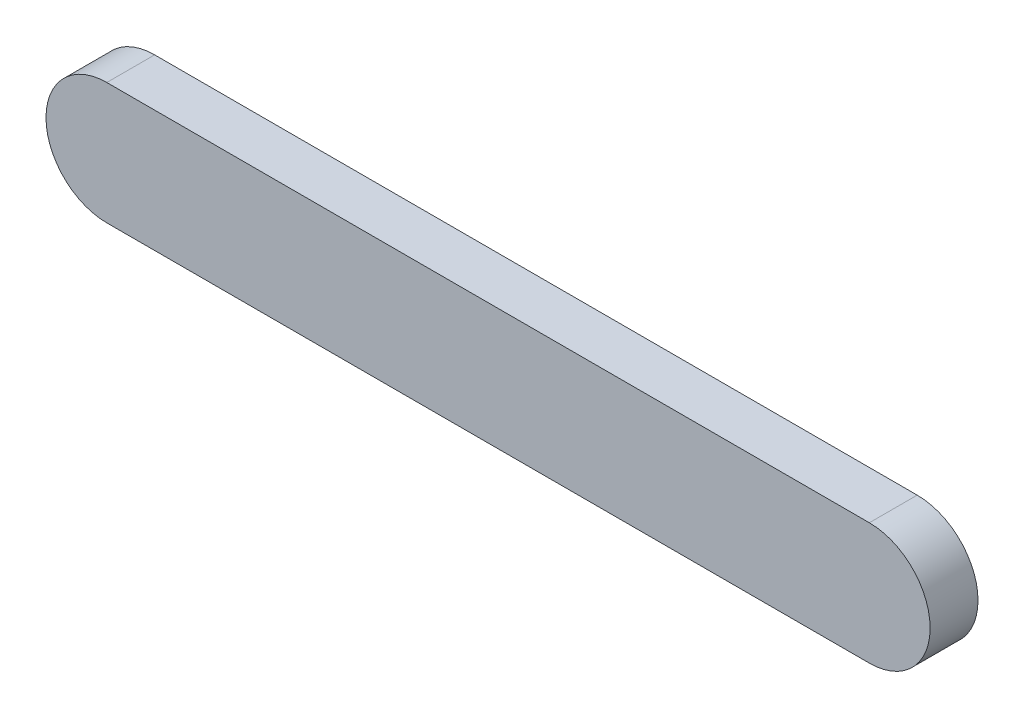
ISO-10303-21;
HEADER;
FILE_DESCRIPTION(('STEP AP214'),'2;1');
FILE_NAME('part.step','',(''),(''),'','','');
FILE_SCHEMA(('AUTOMOTIVE_DESIGN { 1 0 10303 214 1 1 1 1 }'));
ENDSEC;
DATA;
#1=APPLICATION_CONTEXT('core data for automotive mechanical design processes');
#2=APPLICATION_PROTOCOL_DEFINITION('international standard','automotive_design',2000,#1);
#3=PRODUCT_CONTEXT('',#1,'mechanical');
#4=PRODUCT('Part','Part','',(#3));
#5=PRODUCT_RELATED_PRODUCT_CATEGORY('part','',(#4));
#6=PRODUCT_DEFINITION_FORMATION('','',#4);
#7=PRODUCT_DEFINITION_CONTEXT('part definition',#1,'design');
#8=PRODUCT_DEFINITION('design','',#6,#7);
#9=PRODUCT_DEFINITION_SHAPE('','',#8);
#10=(LENGTH_UNIT() NAMED_UNIT(*) SI_UNIT(.MILLI.,.METRE.));
#11=(NAMED_UNIT(*) PLANE_ANGLE_UNIT() SI_UNIT($,.RADIAN.));
#12=(NAMED_UNIT(*) SI_UNIT($,.STERADIAN.) SOLID_ANGLE_UNIT());
#13=UNCERTAINTY_MEASURE_WITH_UNIT(LENGTH_MEASURE(1.E-05),#10,'distance_accuracy_value','');
#14=(GEOMETRIC_REPRESENTATION_CONTEXT(3) GLOBAL_UNCERTAINTY_ASSIGNED_CONTEXT((#13)) GLOBAL_UNIT_ASSIGNED_CONTEXT((#10,
#11,#12)) REPRESENTATION_CONTEXT('',''));
#15=CARTESIAN_POINT('',(0.,0.,0.));
#16=DIRECTION('',(0.,0.,1.));
#17=DIRECTION('',(1.,0.,0.));
#18=AXIS2_PLACEMENT_3D('',#15,#16,#17);
#19=CARTESIAN_POINT('',(93.4862748,64.3636,0.));
#20=DIRECTION('',(0.,1.,0.));
#21=DIRECTION('',(1.,0.,0.));
#22=AXIS2_PLACEMENT_3D('',#19,#20,#21);
#23=PLANE('',#22);
#24=DIRECTION('',(1.,0.,0.));
#25=VECTOR('',#24,1.);
#26=CARTESIAN_POINT('',(93.4862748,64.3636,0.1999996));
#27=LINE('',#26,#25);
#28=CARTESIAN_POINT('',(93.4862748,64.3636,0.1999996));
#29=VERTEX_POINT('',#28);
#30=CARTESIAN_POINT('',(96.6724,64.3636,0.1999996));
#31=VERTEX_POINT('',#30);
#32=EDGE_CURVE('E11',#29,#31,#27,.T.);
#33=ORIENTED_EDGE('',*,*,#32,.F.);
#34=DIRECTION('',(0.,0.,1.));
#35=VECTOR('',#34,1.);
#36=CARTESIAN_POINT('',(93.4862748,64.3636,0.));
#37=LINE('',#36,#35);
#38=CARTESIAN_POINT('',(93.4862748,64.3636,0.));
#39=VERTEX_POINT('',#38);
#40=EDGE_CURVE('E24',#39,#29,#37,.T.);
#41=ORIENTED_EDGE('',*,*,#40,.F.);
#42=DIRECTION('',(1.,0.,0.));
#43=VECTOR('',#42,1.);
#44=CARTESIAN_POINT('',(93.4862748,64.3636,0.));
#45=LINE('',#44,#43);
#46=CARTESIAN_POINT('',(96.6724,64.3636,0.));
#47=VERTEX_POINT('',#46);
#48=EDGE_CURVE('E75',#39,#47,#45,.T.);
#49=ORIENTED_EDGE('',*,*,#48,.T.);
#50=DIRECTION('',(0.,0.,1.));
#51=VECTOR('',#50,1.);
#52=CARTESIAN_POINT('',(96.6724,64.3636,0.));
#53=LINE('',#52,#51);
#54=EDGE_CURVE('E37',#47,#31,#53,.T.);
#55=ORIENTED_EDGE('',*,*,#54,.T.);
#56=EDGE_LOOP('',(#33,#41,#49,#55));
#57=FACE_BOUND('',#56,.T.);
#58=ADVANCED_FACE('F17',(#57),#23,.F.);
#59=CARTESIAN_POINT('',(96.6724,64.6176,0.));
#60=DIRECTION('',(0.,0.,-1.));
#61=DIRECTION('',(0.,-1.,0.));
#62=AXIS2_PLACEMENT_3D('',#59,#60,#61);
#63=CYLINDRICAL_SURFACE('',#62,0.254);
#64=CARTESIAN_POINT('',(96.6724,64.6176,0.1999996));
#65=DIRECTION('',(0.,0.,1.));
#66=DIRECTION('',(0.,-1.,0.));
#67=AXIS2_PLACEMENT_3D('',#64,#65,#66);
#68=CIRCLE('',#67,0.254);
#69=CARTESIAN_POINT('',(96.6724,64.8716,0.1999996));
#70=VERTEX_POINT('',#69);
#71=EDGE_CURVE('E83',#31,#70,#68,.T.);
#72=ORIENTED_EDGE('',*,*,#71,.F.);
#73=ORIENTED_EDGE('',*,*,#54,.F.);
#74=CARTESIAN_POINT('',(96.6724,64.6176,0.));
#75=DIRECTION('',(0.,0.,1.));
#76=DIRECTION('',(0.,-1.,0.));
#77=AXIS2_PLACEMENT_3D('',#74,#75,#76);
#78=CIRCLE('',#77,0.254);
#79=CARTESIAN_POINT('',(96.6724,64.8716,0.));
#80=VERTEX_POINT('',#79);
#81=EDGE_CURVE('E81',#47,#80,#78,.T.);
#82=ORIENTED_EDGE('',*,*,#81,.T.);
#83=DIRECTION('',(0.,0.,1.));
#84=VECTOR('',#83,1.);
#85=CARTESIAN_POINT('',(96.6724,64.8716,0.));
#86=LINE('',#85,#84);
#87=EDGE_CURVE('E67',#80,#70,#86,.T.);
#88=ORIENTED_EDGE('',*,*,#87,.T.);
#89=EDGE_LOOP('',(#72,#73,#82,#88));
#90=FACE_BOUND('',#89,.T.);
#91=ADVANCED_FACE('F89',(#90),#63,.T.);
#92=CARTESIAN_POINT('',(96.6724,64.8716,0.));
#93=DIRECTION('',(0.,-1.,0.));
#94=DIRECTION('',(-1.,0.,0.));
#95=AXIS2_PLACEMENT_3D('',#92,#93,#94);
#96=PLANE('',#95);
#97=DIRECTION('',(-1.,0.,0.));
#98=VECTOR('',#97,1.);
#99=CARTESIAN_POINT('',(96.6724,64.8716,0.1999996));
#100=LINE('',#99,#98);
#101=CARTESIAN_POINT('',(93.4862748,64.8716,0.1999996));
#102=VERTEX_POINT('',#101);
#103=EDGE_CURVE('E71',#70,#102,#100,.T.);
#104=ORIENTED_EDGE('',*,*,#103,.F.);
#105=ORIENTED_EDGE('',*,*,#87,.F.);
#106=DIRECTION('',(-1.,0.,0.));
#107=VECTOR('',#106,1.);
#108=CARTESIAN_POINT('',(96.6724,64.8716,0.));
#109=LINE('',#108,#107);
#110=CARTESIAN_POINT('',(93.4862748,64.8716,0.));
#111=VERTEX_POINT('',#110);
#112=EDGE_CURVE('E63',#80,#111,#109,.T.);
#113=ORIENTED_EDGE('',*,*,#112,.T.);
#114=DIRECTION('',(0.,0.,1.));
#115=VECTOR('',#114,1.);
#116=CARTESIAN_POINT('',(93.4862748,64.8716,0.));
#117=LINE('',#116,#115);
#118=EDGE_CURVE('E53',#111,#102,#117,.T.);
#119=ORIENTED_EDGE('',*,*,#118,.T.);
#120=EDGE_LOOP('',(#104,#105,#113,#119));
#121=FACE_BOUND('',#120,.T.);
#122=ADVANCED_FACE('F66',(#121),#96,.F.);
#123=CARTESIAN_POINT('',(93.4862748,64.6176,0.));
#124=DIRECTION('',(0.,0.,-1.));
#125=DIRECTION('',(0.,1.,0.));
#126=AXIS2_PLACEMENT_3D('',#123,#124,#125);
#127=CYLINDRICAL_SURFACE('',#126,0.253999999999995);
#128=CARTESIAN_POINT('',(93.4862748,64.6176,0.1999996));
#129=DIRECTION('',(0.,0.,1.));
#130=DIRECTION('',(0.,1.,0.));
#131=AXIS2_PLACEMENT_3D('',#128,#129,#130);
#132=CIRCLE('',#131,0.253999999999995);
#133=EDGE_CURVE('E59',#102,#29,#132,.T.);
#134=ORIENTED_EDGE('',*,*,#133,.F.);
#135=ORIENTED_EDGE('',*,*,#118,.F.);
#136=CARTESIAN_POINT('',(93.4862748,64.6176,0.));
#137=DIRECTION('',(0.,0.,1.));
#138=DIRECTION('',(0.,1.,0.));
#139=AXIS2_PLACEMENT_3D('',#136,#137,#138);
#140=CIRCLE('',#139,0.253999999999995);
#141=EDGE_CURVE('E57',#111,#39,#140,.T.);
#142=ORIENTED_EDGE('',*,*,#141,.T.);
#143=ORIENTED_EDGE('',*,*,#40,.T.);
#144=EDGE_LOOP('',(#134,#135,#142,#143));
#145=FACE_BOUND('',#144,.T.);
#146=ADVANCED_FACE('F55',(#145),#127,.T.);
#147=CARTESIAN_POINT('',(93.4862748,64.3636,0.));
#148=DIRECTION('',(0.,0.,-1.));
#149=DIRECTION('',(-1.,0.,0.));
#150=AXIS2_PLACEMENT_3D('',#147,#148,#149);
#151=PLANE('',#150);
#152=ORIENTED_EDGE('',*,*,#141,.F.);
#153=ORIENTED_EDGE('',*,*,#112,.F.);
#154=ORIENTED_EDGE('',*,*,#81,.F.);
#155=ORIENTED_EDGE('',*,*,#48,.F.);
#156=EDGE_LOOP('',(#152,#153,#154,#155));
#157=FACE_BOUND('',#156,.T.);
#158=ADVANCED_FACE('F74',(#157),#151,.T.);
#159=CARTESIAN_POINT('',(93.4862748,64.3636,0.1999996));
#160=DIRECTION('',(0.,0.,-1.));
#161=DIRECTION('',(-1.,0.,0.));
#162=AXIS2_PLACEMENT_3D('',#159,#160,#161);
#163=PLANE('',#162);
#164=ORIENTED_EDGE('',*,*,#32,.T.);
#165=ORIENTED_EDGE('',*,*,#71,.T.);
#166=ORIENTED_EDGE('',*,*,#103,.T.);
#167=ORIENTED_EDGE('',*,*,#133,.T.);
#168=EDGE_LOOP('',(#164,#165,#166,#167));
#169=FACE_BOUND('',#168,.T.);
#170=ADVANCED_FACE('F91',(#169),#163,.F.);
#171=CLOSED_SHELL('',(#58,#91,#122,#146,#158,#170));
#172=MANIFOLD_SOLID_BREP('B1',#171);
#173=ADVANCED_BREP_SHAPE_REPRESENTATION('',(#18,#172),#14);
#174=SHAPE_DEFINITION_REPRESENTATION(#9,#173);
ENDSEC;
END-ISO-10303-21;
